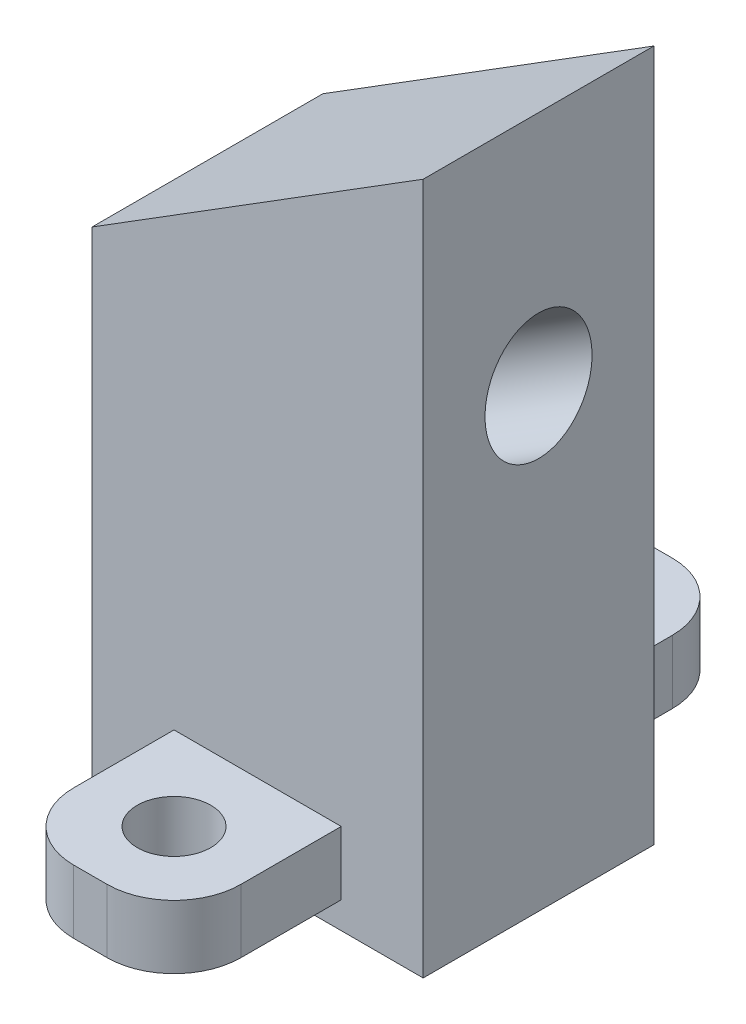
ISO-10303-21;
HEADER;
FILE_DESCRIPTION(('STEP AP214'),'2;1');
FILE_NAME('part.step','',(''),(''),'','','');
FILE_SCHEMA(('AUTOMOTIVE_DESIGN { 1 0 10303 214 1 1 1 1 }'));
ENDSEC;
DATA;
#1=APPLICATION_CONTEXT('core data for automotive mechanical design processes');
#2=APPLICATION_PROTOCOL_DEFINITION('international standard','automotive_design',2000,#1);
#3=PRODUCT_CONTEXT('',#1,'mechanical');
#4=PRODUCT('Part','Part','',(#3));
#5=PRODUCT_RELATED_PRODUCT_CATEGORY('part','',(#4));
#6=PRODUCT_DEFINITION_FORMATION('','',#4);
#7=PRODUCT_DEFINITION_CONTEXT('part definition',#1,'design');
#8=PRODUCT_DEFINITION('design','',#6,#7);
#9=PRODUCT_DEFINITION_SHAPE('','',#8);
#10=(LENGTH_UNIT() NAMED_UNIT(*) SI_UNIT(.MILLI.,.METRE.));
#11=(NAMED_UNIT(*) PLANE_ANGLE_UNIT() SI_UNIT($,.RADIAN.));
#12=(NAMED_UNIT(*) SI_UNIT($,.STERADIAN.) SOLID_ANGLE_UNIT());
#13=UNCERTAINTY_MEASURE_WITH_UNIT(LENGTH_MEASURE(1.E-05),#10,'distance_accuracy_value','');
#14=(GEOMETRIC_REPRESENTATION_CONTEXT(3) GLOBAL_UNCERTAINTY_ASSIGNED_CONTEXT((#13)) GLOBAL_UNIT_ASSIGNED_CONTEXT((#10,
#11,#12)) REPRESENTATION_CONTEXT('',''));
#15=CARTESIAN_POINT('',(0.,0.,0.));
#16=DIRECTION('',(0.,0.,1.));
#17=DIRECTION('',(1.,0.,0.));
#18=AXIS2_PLACEMENT_3D('',#15,#16,#17);
#19=CARTESIAN_POINT('',(-6.20378690597744,5.07930318868357,0.));
#20=DIRECTION('',(0.848048096156425,0.529919264233206,0.));
#21=DIRECTION('',(-0.529919264233206,0.848048096156425,0.));
#22=AXIS2_PLACEMENT_3D('',#19,#20,#21);
#23=CYLINDRICAL_SURFACE('',#22,1.6);
#24=CARTESIAN_POINT('',(7.45,13.6111361637298,0.));
#25=DIRECTION('',(-1.,0.,0.));
#26=DIRECTION('',(0.,1.,0.));
#27=AXIS2_PLACEMENT_3D('',#24,#25,#26);
#28=ELLIPSE('',#27,1.88668544537936,1.6);
#29=CARTESIAN_POINT('',(7.45,15.4978216091091,0.));
#30=VERTEX_POINT('',#29);
#31=EDGE_CURVE('E212',#30,#30,#28,.T.);
#32=ORIENTED_EDGE('',*,*,#31,.F.);
#33=EDGE_LOOP('',(#32));
#34=FACE_BOUND('',#33,.T.);
#35=CARTESIAN_POINT('',(-1.45,8.04979893173675,0.));
#36=DIRECTION('',(-1.,0.,0.));
#37=DIRECTION('',(0.,1.,0.));
#38=AXIS2_PLACEMENT_3D('',#35,#36,#37);
#39=ELLIPSE('',#38,1.88668544537936,1.6);
#40=CARTESIAN_POINT('',(-1.45,9.9364843771161,0.));
#41=VERTEX_POINT('',#40);
#42=EDGE_CURVE('E12',#41,#41,#39,.F.);
#43=ORIENTED_EDGE('',*,*,#42,.F.);
#44=EDGE_LOOP('',(#43));
#45=FACE_BOUND('',#44,.T.);
#46=ADVANCED_FACE('F43',(#34,#45),#23,.F.);
#47=CARTESIAN_POINT('',(-4.95,1.5,-3.45));
#48=DIRECTION('',(0.,0.,1.));
#49=DIRECTION('',(1.,0.,0.));
#50=AXIS2_PLACEMENT_3D('',#47,#48,#49);
#51=PLANE('',#50);
#52=DIRECTION('',(0.,1.,0.));
#53=VECTOR('',#52,1.);
#54=CARTESIAN_POINT('',(-2.45,1.5,-3.45));
#55=LINE('',#54,#53);
#56=CARTESIAN_POINT('',(-2.45,0.,-3.45));
#57=VERTEX_POINT('',#56);
#58=CARTESIAN_POINT('',(-2.45,14.5,-3.45));
#59=VERTEX_POINT('',#58);
#60=EDGE_CURVE('E217',#57,#59,#55,.T.);
#61=ORIENTED_EDGE('',*,*,#60,.T.);
#62=DIRECTION('',(0.848048096156425,0.529919264233206,0.));
#63=VECTOR('',#62,1.);
#64=CARTESIAN_POINT('',(-2.45,14.5,-3.45));
#65=LINE('',#64,#63);
#66=CARTESIAN_POINT('',(7.45,20.6862065839024,-3.45));
#67=VERTEX_POINT('',#66);
#68=EDGE_CURVE('E222',#59,#67,#65,.T.);
#69=ORIENTED_EDGE('',*,*,#68,.T.);
#70=DIRECTION('',(0.,-1.,0.));
#71=VECTOR('',#70,1.);
#72=CARTESIAN_POINT('',(7.45,1.5,-3.45));
#73=LINE('',#72,#71);
#74=CARTESIAN_POINT('',(7.45,0.,-3.45));
#75=VERTEX_POINT('',#74);
#76=EDGE_CURVE('E244',#67,#75,#73,.T.);
#77=ORIENTED_EDGE('',*,*,#76,.T.);
#78=DIRECTION('',(-1.,0.,0.));
#79=VECTOR('',#78,1.);
#80=CARTESIAN_POINT('',(-4.95,0.,-3.45));
#81=LINE('',#80,#79);
#82=EDGE_CURVE('E237',#75,#57,#81,.T.);
#83=ORIENTED_EDGE('',*,*,#82,.T.);
#84=EDGE_LOOP('',(#61,#69,#77,#83));
#85=FACE_BOUND('',#84,.T.);
#86=DIRECTION('',(-1.,0.,0.));
#87=VECTOR('',#86,1.);
#88=CARTESIAN_POINT('',(0.,2.7,-3.45));
#89=LINE('',#88,#87);
#90=CARTESIAN_POINT('',(5.,2.7,-3.45));
#91=VERTEX_POINT('',#90);
#92=CARTESIAN_POINT('',(0.,2.7,-3.45));
#93=VERTEX_POINT('',#92);
#94=EDGE_CURVE('E161',#91,#93,#89,.T.);
#95=ORIENTED_EDGE('',*,*,#94,.T.);
#96=DIRECTION('',(0.,-1.,0.));
#97=VECTOR('',#96,1.);
#98=CARTESIAN_POINT('',(0.,2.7,-3.45));
#99=LINE('',#98,#97);
#100=CARTESIAN_POINT('',(0.,0.8,-3.45));
#101=VERTEX_POINT('',#100);
#102=EDGE_CURVE('E175',#93,#101,#99,.T.);
#103=ORIENTED_EDGE('',*,*,#102,.T.);
#104=DIRECTION('',(-1.,0.,0.));
#105=VECTOR('',#104,1.);
#106=CARTESIAN_POINT('',(0.,0.8,-3.45));
#107=LINE('',#106,#105);
#108=CARTESIAN_POINT('',(5.,0.8,-3.45));
#109=VERTEX_POINT('',#108);
#110=EDGE_CURVE('E174',#109,#101,#107,.T.);
#111=ORIENTED_EDGE('',*,*,#110,.F.);
#112=DIRECTION('',(0.,-1.,0.));
#113=VECTOR('',#112,1.);
#114=CARTESIAN_POINT('',(5.,2.7,-3.45));
#115=LINE('',#114,#113);
#116=EDGE_CURVE('E159',#91,#109,#115,.T.);
#117=ORIENTED_EDGE('',*,*,#116,.F.);
#118=EDGE_LOOP('',(#95,#103,#111,#117));
#119=FACE_BOUND('',#118,.T.);
#120=ADVANCED_FACE('F172',(#85,#119),#51,.F.);
#121=CARTESIAN_POINT('',(-4.95,1.5,3.45));
#122=DIRECTION('',(0.,0.,-1.));
#123=DIRECTION('',(-1.,0.,0.));
#124=AXIS2_PLACEMENT_3D('',#121,#122,#123);
#125=PLANE('',#124);
#126=DIRECTION('',(0.848048096156425,0.529919264233206,0.));
#127=VECTOR('',#126,1.);
#128=CARTESIAN_POINT('',(-2.45,14.5,3.45));
#129=LINE('',#128,#127);
#130=CARTESIAN_POINT('',(-2.45,14.5,3.45));
#131=VERTEX_POINT('',#130);
#132=CARTESIAN_POINT('',(7.45,20.6862065839024,3.45));
#133=VERTEX_POINT('',#132);
#134=EDGE_CURVE('E221',#131,#133,#129,.T.);
#135=ORIENTED_EDGE('',*,*,#134,.F.);
#136=DIRECTION('',(0.,1.,0.));
#137=VECTOR('',#136,1.);
#138=CARTESIAN_POINT('',(-2.45,1.5,3.45));
#139=LINE('',#138,#137);
#140=CARTESIAN_POINT('',(-2.45,0.,3.45));
#141=VERTEX_POINT('',#140);
#142=EDGE_CURVE('E218',#141,#131,#139,.T.);
#143=ORIENTED_EDGE('',*,*,#142,.F.);
#144=DIRECTION('',(1.,0.,0.));
#145=VECTOR('',#144,1.);
#146=CARTESIAN_POINT('',(-4.95,0.,3.45));
#147=LINE('',#146,#145);
#148=CARTESIAN_POINT('',(7.45,0.,3.45));
#149=VERTEX_POINT('',#148);
#150=EDGE_CURVE('E239',#141,#149,#147,.T.);
#151=ORIENTED_EDGE('',*,*,#150,.T.);
#152=DIRECTION('',(0.,-1.,0.));
#153=VECTOR('',#152,1.);
#154=CARTESIAN_POINT('',(7.45,1.5,3.45));
#155=LINE('',#154,#153);
#156=EDGE_CURVE('E241',#133,#149,#155,.T.);
#157=ORIENTED_EDGE('',*,*,#156,.F.);
#158=EDGE_LOOP('',(#135,#143,#151,#157));
#159=FACE_BOUND('',#158,.T.);
#160=DIRECTION('',(-1.,0.,0.));
#161=VECTOR('',#160,1.);
#162=CARTESIAN_POINT('',(0.,2.7,3.45));
#163=LINE('',#162,#161);
#164=CARTESIAN_POINT('',(5.,2.7,3.45));
#165=VERTEX_POINT('',#164);
#166=CARTESIAN_POINT('',(0.,2.7,3.45));
#167=VERTEX_POINT('',#166);
#168=EDGE_CURVE('E194',#165,#167,#163,.T.);
#169=ORIENTED_EDGE('',*,*,#168,.F.);
#170=DIRECTION('',(0.,-1.,0.));
#171=VECTOR('',#170,1.);
#172=CARTESIAN_POINT('',(5.,2.7,3.45));
#173=LINE('',#172,#171);
#174=CARTESIAN_POINT('',(5.,0.8,3.45));
#175=VERTEX_POINT('',#174);
#176=EDGE_CURVE('E209',#165,#175,#173,.T.);
#177=ORIENTED_EDGE('',*,*,#176,.T.);
#178=DIRECTION('',(-1.,0.,0.));
#179=VECTOR('',#178,1.);
#180=CARTESIAN_POINT('',(0.,0.8,3.45));
#181=LINE('',#180,#179);
#182=CARTESIAN_POINT('',(0.,0.8,3.45));
#183=VERTEX_POINT('',#182);
#184=EDGE_CURVE('E187',#175,#183,#181,.T.);
#185=ORIENTED_EDGE('',*,*,#184,.T.);
#186=DIRECTION('',(0.,-1.,0.));
#187=VECTOR('',#186,1.);
#188=CARTESIAN_POINT('',(0.,2.7,3.45));
#189=LINE('',#188,#187);
#190=EDGE_CURVE('E197',#167,#183,#189,.T.);
#191=ORIENTED_EDGE('',*,*,#190,.F.);
#192=EDGE_LOOP('',(#169,#177,#185,#191));
#193=FACE_BOUND('',#192,.T.);
#194=ADVANCED_FACE('F331',(#159,#193),#125,.F.);
#195=CARTESIAN_POINT('',(7.45,1.5,-3.45));
#196=DIRECTION('',(-1.,0.,0.));
#197=DIRECTION('',(0.,0.,1.));
#198=AXIS2_PLACEMENT_3D('',#195,#196,#197);
#199=PLANE('',#198);
#200=ORIENTED_EDGE('',*,*,#31,.T.);
#201=EDGE_LOOP('',(#200));
#202=FACE_BOUND('',#201,.T.);
#203=DIRECTION('',(0.,0.,-1.));
#204=VECTOR('',#203,1.);
#205=CARTESIAN_POINT('',(7.45,0.,-3.45));
#206=LINE('',#205,#204);
#207=EDGE_CURVE('E233',#149,#75,#206,.T.);
#208=ORIENTED_EDGE('',*,*,#207,.T.);
#209=ORIENTED_EDGE('',*,*,#76,.F.);
#210=DIRECTION('',(0.,0.,-1.));
#211=VECTOR('',#210,1.);
#212=CARTESIAN_POINT('',(7.45,20.6862065839024,3.45));
#213=LINE('',#212,#211);
#214=EDGE_CURVE('E230',#133,#67,#213,.T.);
#215=ORIENTED_EDGE('',*,*,#214,.F.);
#216=ORIENTED_EDGE('',*,*,#156,.T.);
#217=EDGE_LOOP('',(#208,#209,#215,#216));
#218=FACE_BOUND('',#217,.T.);
#219=ADVANCED_FACE('F352',(#202,#218),#199,.F.);
#220=CARTESIAN_POINT('',(-4.95,0.,0.950000000000001));
#221=DIRECTION('',(0.,-1.,0.));
#222=DIRECTION('',(0.,0.,-1.));
#223=AXIS2_PLACEMENT_3D('',#220,#221,#222);
#224=PLANE('',#223);
#225=DIRECTION('',(0.,0.,1.));
#226=VECTOR('',#225,1.);
#227=CARTESIAN_POINT('',(-2.45,0.,0.95));
#228=LINE('',#227,#226);
#229=EDGE_CURVE('E247',#57,#141,#228,.T.);
#230=ORIENTED_EDGE('',*,*,#229,.F.);
#231=ORIENTED_EDGE('',*,*,#82,.F.);
#232=ORIENTED_EDGE('',*,*,#207,.F.);
#233=ORIENTED_EDGE('',*,*,#150,.F.);
#234=EDGE_LOOP('',(#230,#231,#232,#233));
#235=FACE_BOUND('',#234,.T.);
#236=ADVANCED_FACE('F344',(#235),#224,.T.);
#237=CARTESIAN_POINT('',(-2.45,14.5,3.45));
#238=DIRECTION('',(-0.529919264233206,0.848048096156425,0.));
#239=DIRECTION('',(-0.848048096156425,-0.529919264233206,0.));
#240=AXIS2_PLACEMENT_3D('',#237,#238,#239);
#241=PLANE('',#240);
#242=ORIENTED_EDGE('',*,*,#68,.F.);
#243=DIRECTION('',(0.,0.,-1.));
#244=VECTOR('',#243,1.);
#245=CARTESIAN_POINT('',(-2.45,14.5,3.45));
#246=LINE('',#245,#244);
#247=EDGE_CURVE('E225',#131,#59,#246,.T.);
#248=ORIENTED_EDGE('',*,*,#247,.F.);
#249=ORIENTED_EDGE('',*,*,#134,.T.);
#250=ORIENTED_EDGE('',*,*,#214,.T.);
#251=EDGE_LOOP('',(#242,#248,#249,#250));
#252=FACE_BOUND('',#251,.T.);
#253=ADVANCED_FACE('F340',(#252),#241,.T.);
#254=CARTESIAN_POINT('',(-2.45,1.5,3.45));
#255=DIRECTION('',(-1.,0.,0.));
#256=DIRECTION('',(0.,-1.,0.));
#257=AXIS2_PLACEMENT_3D('',#254,#255,#256);
#258=PLANE('',#257);
#259=ORIENTED_EDGE('',*,*,#60,.F.);
#260=ORIENTED_EDGE('',*,*,#229,.T.);
#261=ORIENTED_EDGE('',*,*,#142,.T.);
#262=ORIENTED_EDGE('',*,*,#247,.T.);
#263=EDGE_LOOP('',(#259,#260,#261,#262));
#264=FACE_BOUND('',#263,.T.);
#265=ADVANCED_FACE('F343',(#264),#258,.T.);
#266=CARTESIAN_POINT('',(5.,2.7,0.));
#267=DIRECTION('',(-1.,0.,0.));
#268=DIRECTION('',(0.,0.,1.));
#269=AXIS2_PLACEMENT_3D('',#266,#267,#268);
#270=PLANE('',#269);
#271=DIRECTION('',(0.,0.,-1.));
#272=VECTOR('',#271,1.);
#273=CARTESIAN_POINT('',(5.,2.7,0.));
#274=LINE('',#273,#272);
#275=CARTESIAN_POINT('',(5.,2.7,6.45));
#276=VERTEX_POINT('',#275);
#277=EDGE_CURVE('E186',#276,#165,#274,.T.);
#278=ORIENTED_EDGE('',*,*,#277,.F.);
#279=DIRECTION('',(0.,-1.,0.));
#280=VECTOR('',#279,1.);
#281=CARTESIAN_POINT('',(5.,2.7,6.45));
#282=LINE('',#281,#280);
#283=CARTESIAN_POINT('',(5.,0.8,6.45));
#284=VERTEX_POINT('',#283);
#285=EDGE_CURVE('E265',#276,#284,#282,.T.);
#286=ORIENTED_EDGE('',*,*,#285,.T.);
#287=DIRECTION('',(0.,0.,-1.));
#288=VECTOR('',#287,1.);
#289=CARTESIAN_POINT('',(5.,0.8,0.));
#290=LINE('',#289,#288);
#291=EDGE_CURVE('E200',#284,#175,#290,.T.);
#292=ORIENTED_EDGE('',*,*,#291,.T.);
#293=ORIENTED_EDGE('',*,*,#176,.F.);
#294=EDGE_LOOP('',(#278,#286,#292,#293));
#295=FACE_BOUND('',#294,.T.);
#296=ADVANCED_FACE('F348',(#295),#270,.F.);
#297=CARTESIAN_POINT('',(0.,2.7,0.));
#298=DIRECTION('',(-1.,0.,0.));
#299=DIRECTION('',(0.,0.,1.));
#300=AXIS2_PLACEMENT_3D('',#297,#298,#299);
#301=PLANE('',#300);
#302=DIRECTION('',(0.,0.,-1.));
#303=VECTOR('',#302,1.);
#304=CARTESIAN_POINT('',(0.,0.8,0.));
#305=LINE('',#304,#303);
#306=CARTESIAN_POINT('',(0.,0.8,6.45));
#307=VERTEX_POINT('',#306);
#308=EDGE_CURVE('E205',#307,#183,#305,.T.);
#309=ORIENTED_EDGE('',*,*,#308,.F.);
#310=DIRECTION('',(0.,-1.,0.));
#311=VECTOR('',#310,1.);
#312=CARTESIAN_POINT('',(0.,2.7,6.45));
#313=LINE('',#312,#311);
#314=CARTESIAN_POINT('',(0.,2.7,6.45));
#315=VERTEX_POINT('',#314);
#316=EDGE_CURVE('E259',#307,#315,#313,.F.);
#317=ORIENTED_EDGE('',*,*,#316,.T.);
#318=DIRECTION('',(0.,0.,-1.));
#319=VECTOR('',#318,1.);
#320=CARTESIAN_POINT('',(0.,2.7,0.));
#321=LINE('',#320,#319);
#322=EDGE_CURVE('E192',#315,#167,#321,.T.);
#323=ORIENTED_EDGE('',*,*,#322,.T.);
#324=ORIENTED_EDGE('',*,*,#190,.T.);
#325=EDGE_LOOP('',(#309,#317,#323,#324));
#326=FACE_BOUND('',#325,.T.);
#327=ADVANCED_FACE('F471',(#326),#301,.T.);
#328=CARTESIAN_POINT('',(2.5,2.7,5.95));
#329=DIRECTION('',(0.,-1.,0.));
#330=DIRECTION('',(0.,0.,-1.));
#331=AXIS2_PLACEMENT_3D('',#328,#329,#330);
#332=CYLINDRICAL_SURFACE('',#331,1.1);
#333=CARTESIAN_POINT('',(2.5,2.7,5.95));
#334=DIRECTION('',(0.,-1.,0.));
#335=DIRECTION('',(0.,0.,-1.));
#336=AXIS2_PLACEMENT_3D('',#333,#334,#335);
#337=CIRCLE('',#336,1.1);
#338=CARTESIAN_POINT('',(2.5,2.7,4.85));
#339=VERTEX_POINT('',#338);
#340=EDGE_CURVE('E183',#339,#339,#337,.T.);
#341=CARTESIAN_POINT('',(2.5,0.8,5.95));
#342=DIRECTION('',(0.,-1.,0.));
#343=DIRECTION('',(0.,0.,-1.));
#344=AXIS2_PLACEMENT_3D('',#341,#342,#343);
#345=CIRCLE('',#344,1.1);
#346=CARTESIAN_POINT('',(2.5,0.8,4.85));
#347=VERTEX_POINT('',#346);
#348=EDGE_CURVE('E178',#347,#347,#345,.T.);
#349=CARTESIAN_POINT('',(2.5,2.7,4.85));
#350=CARTESIAN_POINT('',(2.5,2.68020833333333,4.85));
#351=CARTESIAN_POINT('',(2.5,2.66041666666667,4.85));
#352=CARTESIAN_POINT('',(2.5,2.62083333333333,4.85));
#353=CARTESIAN_POINT('',(2.5,2.60104166666667,4.85));
#354=CARTESIAN_POINT('',(2.5,2.56145833333333,4.85));
#355=CARTESIAN_POINT('',(2.5,2.54166666666667,4.85));
#356=CARTESIAN_POINT('',(2.5,2.50208333333333,4.85));
#357=CARTESIAN_POINT('',(2.5,2.48229166666667,4.85));
#358=CARTESIAN_POINT('',(2.5,2.44270833333333,4.85));
#359=CARTESIAN_POINT('',(2.5,2.42291666666667,4.85));
#360=CARTESIAN_POINT('',(2.5,2.38333333333333,4.85));
#361=CARTESIAN_POINT('',(2.5,2.36354166666667,4.85));
#362=CARTESIAN_POINT('',(2.5,2.32395833333333,4.85));
#363=CARTESIAN_POINT('',(2.5,2.30416666666667,4.85));
#364=CARTESIAN_POINT('',(2.5,2.26458333333333,4.85));
#365=CARTESIAN_POINT('',(2.5,2.24479166666667,4.85));
#366=CARTESIAN_POINT('',(2.5,2.20520833333333,4.85));
#367=CARTESIAN_POINT('',(2.5,2.18541666666667,4.85));
#368=CARTESIAN_POINT('',(2.5,2.14583333333333,4.85));
#369=CARTESIAN_POINT('',(2.5,2.12604166666667,4.85));
#370=CARTESIAN_POINT('',(2.5,2.08645833333333,4.85));
#371=CARTESIAN_POINT('',(2.5,2.06666666666667,4.85));
#372=CARTESIAN_POINT('',(2.5,2.02708333333333,4.85));
#373=CARTESIAN_POINT('',(2.5,2.00729166666667,4.85));
#374=CARTESIAN_POINT('',(2.5,1.96770833333333,4.85));
#375=CARTESIAN_POINT('',(2.5,1.94791666666667,4.85));
#376=CARTESIAN_POINT('',(2.5,1.90833333333333,4.85));
#377=CARTESIAN_POINT('',(2.5,1.88854166666667,4.85));
#378=CARTESIAN_POINT('',(2.5,1.84895833333333,4.85));
#379=CARTESIAN_POINT('',(2.5,1.82916666666667,4.85));
#380=CARTESIAN_POINT('',(2.5,1.78958333333333,4.85));
#381=CARTESIAN_POINT('',(2.5,1.76979166666667,4.85));
#382=CARTESIAN_POINT('',(2.5,1.73020833333333,4.85));
#383=CARTESIAN_POINT('',(2.5,1.71041666666667,4.85));
#384=CARTESIAN_POINT('',(2.5,1.67083333333333,4.85));
#385=CARTESIAN_POINT('',(2.5,1.65104166666667,4.85));
#386=CARTESIAN_POINT('',(2.5,1.61145833333333,4.85));
#387=CARTESIAN_POINT('',(2.5,1.59166666666667,4.85));
#388=CARTESIAN_POINT('',(2.5,1.55208333333333,4.85));
#389=CARTESIAN_POINT('',(2.5,1.53229166666667,4.85));
#390=CARTESIAN_POINT('',(2.5,1.49270833333333,4.85));
#391=CARTESIAN_POINT('',(2.5,1.47291666666667,4.85));
#392=CARTESIAN_POINT('',(2.5,1.43333333333333,4.85));
#393=CARTESIAN_POINT('',(2.5,1.41354166666667,4.85));
#394=CARTESIAN_POINT('',(2.5,1.37395833333333,4.85));
#395=CARTESIAN_POINT('',(2.5,1.35416666666667,4.85));
#396=CARTESIAN_POINT('',(2.5,1.31458333333333,4.85));
#397=CARTESIAN_POINT('',(2.5,1.29479166666667,4.85));
#398=CARTESIAN_POINT('',(2.5,1.25520833333333,4.85));
#399=CARTESIAN_POINT('',(2.5,1.23541666666667,4.85));
#400=CARTESIAN_POINT('',(2.5,1.19583333333333,4.85));
#401=CARTESIAN_POINT('',(2.5,1.17604166666667,4.85));
#402=CARTESIAN_POINT('',(2.5,1.13645833333333,4.85));
#403=CARTESIAN_POINT('',(2.5,1.11666666666667,4.85));
#404=CARTESIAN_POINT('',(2.5,1.07708333333333,4.85));
#405=CARTESIAN_POINT('',(2.5,1.05729166666667,4.85));
#406=CARTESIAN_POINT('',(2.5,1.01770833333333,4.85));
#407=CARTESIAN_POINT('',(2.5,0.997916666666667,4.85));
#408=CARTESIAN_POINT('',(2.5,0.958333333333333,4.85));
#409=CARTESIAN_POINT('',(2.5,0.938541666666667,4.85));
#410=CARTESIAN_POINT('',(2.5,0.898958333333333,4.85));
#411=CARTESIAN_POINT('',(2.5,0.879166666666667,4.85));
#412=CARTESIAN_POINT('',(2.5,0.839583333333333,4.85));
#413=CARTESIAN_POINT('',(2.5,0.819791666666667,4.85));
#414=CARTESIAN_POINT('',(2.5,0.8,4.85));
#415=B_SPLINE_CURVE_WITH_KNOTS('',3,(#349,#350,#351,#352,#353,#354,#355,#356,#357,#358,#359,
#360,#361,#362,#363,#364,#365,#366,#367,#368,#369,#370,#371,#372,#373,#374,#375,#376,#377,#378,
#379,#380,#381,#382,#383,#384,#385,#386,#387,#388,#389,#390,#391,#392,#393,#394,#395,#396,#397,
#398,#399,#400,#401,#402,#403,#404,#405,#406,#407,#408,#409,#410,#411,#412,#413,#414),
.UNSPECIFIED.,.F.,.F.,(4,2,2,2,2,2,2,2,2,2,2,2,2,2,2,2,2,2,2,2,2,2,2,2,2,2,2,2,2,2,2,2,4),(0.,
0.059375,0.11875,0.178125,0.2375,0.296875,0.35625,0.415625,0.475,0.534375,0.59375,0.653125,
0.7125,0.771875,0.83125,0.890625,0.95,1.009375,1.06875,1.128125,1.1875,1.246875,1.30625,
1.365625,1.425,1.484375,1.54375,1.603125,1.6625,1.721875,1.78125,1.840625,1.9),.UNSPECIFIED.);
#416=EDGE_CURVE('BSEAM338',#339,#347,#415,.T.);
#417=ORIENTED_EDGE('',*,*,#340,.F.);
#418=ORIENTED_EDGE('',*,*,#348,.T.);
#419=ORIENTED_EDGE('',*,*,#416,.T.);
#420=ORIENTED_EDGE('',*,*,#416,.F.);
#421=EDGE_LOOP('',(#417,#419,#418,#420));
#422=FACE_BOUND('',#421,.T.);
#423=ADVANCED_FACE('F338',(#422),#332,.F.);
#424=CARTESIAN_POINT('',(0.,2.7,8.45));
#425=DIRECTION('',(0.,0.,-1.));
#426=DIRECTION('',(-1.,0.,0.));
#427=AXIS2_PLACEMENT_3D('',#424,#425,#426);
#428=PLANE('',#427);
#429=DIRECTION('',(1.,0.,0.));
#430=VECTOR('',#429,1.);
#431=CARTESIAN_POINT('',(0.,2.7,8.45));
#432=LINE('',#431,#430);
#433=CARTESIAN_POINT('',(2.,2.7,8.45));
#434=VERTEX_POINT('',#433);
#435=CARTESIAN_POINT('',(3.,2.7,8.45));
#436=VERTEX_POINT('',#435);
#437=EDGE_CURVE('E189',#434,#436,#432,.T.);
#438=ORIENTED_EDGE('',*,*,#437,.F.);
#439=DIRECTION('',(0.,-1.,0.));
#440=VECTOR('',#439,1.);
#441=CARTESIAN_POINT('',(2.,0.8,8.45));
#442=LINE('',#441,#440);
#443=CARTESIAN_POINT('',(2.,0.8,8.45));
#444=VERTEX_POINT('',#443);
#445=EDGE_CURVE('E252',#434,#444,#442,.T.);
#446=ORIENTED_EDGE('',*,*,#445,.T.);
#447=DIRECTION('',(1.,0.,0.));
#448=VECTOR('',#447,1.);
#449=CARTESIAN_POINT('',(0.,0.8,8.45));
#450=LINE('',#449,#448);
#451=CARTESIAN_POINT('',(3.,0.8,8.45));
#452=VERTEX_POINT('',#451);
#453=EDGE_CURVE('E202',#444,#452,#450,.T.);
#454=ORIENTED_EDGE('',*,*,#453,.T.);
#455=DIRECTION('',(0.,-1.,0.));
#456=VECTOR('',#455,1.);
#457=CARTESIAN_POINT('',(3.,2.7,8.45));
#458=LINE('',#457,#456);
#459=EDGE_CURVE('E250',#452,#436,#458,.F.);
#460=ORIENTED_EDGE('',*,*,#459,.T.);
#461=EDGE_LOOP('',(#438,#446,#454,#460));
#462=FACE_BOUND('',#461,.T.);
#463=ADVANCED_FACE('F485',(#462),#428,.F.);
#464=CARTESIAN_POINT('',(0.,2.7,0.));
#465=DIRECTION('',(0.,-1.,0.));
#466=DIRECTION('',(0.,0.,-1.));
#467=AXIS2_PLACEMENT_3D('',#464,#465,#466);
#468=PLANE('',#467);
#469=ORIENTED_EDGE('',*,*,#340,.T.);
#470=EDGE_LOOP('',(#469));
#471=FACE_BOUND('',#470,.T.);
#472=ORIENTED_EDGE('',*,*,#322,.F.);
#473=CARTESIAN_POINT('',(2.,2.7,6.45));
#474=DIRECTION('',(0.,-1.,0.));
#475=DIRECTION('',(0.,0.,-1.));
#476=AXIS2_PLACEMENT_3D('',#473,#474,#475);
#477=CIRCLE('',#476,2.);
#478=EDGE_CURVE('E263',#315,#434,#477,.F.);
#479=ORIENTED_EDGE('',*,*,#478,.T.);
#480=ORIENTED_EDGE('',*,*,#437,.T.);
#481=CARTESIAN_POINT('',(3.,2.7,6.45));
#482=DIRECTION('',(0.,-1.,0.));
#483=DIRECTION('',(0.,0.,-1.));
#484=AXIS2_PLACEMENT_3D('',#481,#482,#483);
#485=CIRCLE('',#484,2.);
#486=EDGE_CURVE('E261',#436,#276,#485,.F.);
#487=ORIENTED_EDGE('',*,*,#486,.T.);
#488=ORIENTED_EDGE('',*,*,#277,.T.);
#489=ORIENTED_EDGE('',*,*,#168,.T.);
#490=EDGE_LOOP('',(#472,#479,#480,#487,#488,#489));
#491=FACE_BOUND('',#490,.T.);
#492=ADVANCED_FACE('F492',(#471,#491),#468,.F.);
#493=CARTESIAN_POINT('',(0.,0.8,0.));
#494=DIRECTION('',(0.,-1.,0.));
#495=DIRECTION('',(0.,0.,-1.));
#496=AXIS2_PLACEMENT_3D('',#493,#494,#495);
#497=PLANE('',#496);
#498=ORIENTED_EDGE('',*,*,#348,.F.);
#499=EDGE_LOOP('',(#498));
#500=FACE_BOUND('',#499,.T.);
#501=ORIENTED_EDGE('',*,*,#453,.F.);
#502=CARTESIAN_POINT('',(2.,0.8,6.45));
#503=DIRECTION('',(0.,-1.,0.));
#504=DIRECTION('',(0.,0.,-1.));
#505=AXIS2_PLACEMENT_3D('',#502,#503,#504);
#506=CIRCLE('',#505,2.);
#507=EDGE_CURVE('E257',#444,#307,#506,.T.);
#508=ORIENTED_EDGE('',*,*,#507,.T.);
#509=ORIENTED_EDGE('',*,*,#308,.T.);
#510=ORIENTED_EDGE('',*,*,#184,.F.);
#511=ORIENTED_EDGE('',*,*,#291,.F.);
#512=CARTESIAN_POINT('',(3.,0.8,6.45));
#513=DIRECTION('',(0.,-1.,0.));
#514=DIRECTION('',(0.,0.,-1.));
#515=AXIS2_PLACEMENT_3D('',#512,#513,#514);
#516=CIRCLE('',#515,2.);
#517=EDGE_CURVE('E255',#284,#452,#516,.T.);
#518=ORIENTED_EDGE('',*,*,#517,.T.);
#519=EDGE_LOOP('',(#501,#508,#509,#510,#511,#518));
#520=FACE_BOUND('',#519,.T.);
#521=ADVANCED_FACE('F364',(#500,#520),#497,.T.);
#522=CARTESIAN_POINT('',(2.,2.7,6.45));
#523=DIRECTION('',(0.,1.,0.));
#524=DIRECTION('',(0.,0.,1.));
#525=AXIS2_PLACEMENT_3D('',#522,#523,#524);
#526=CYLINDRICAL_SURFACE('',#525,2.);
#527=ORIENTED_EDGE('',*,*,#478,.F.);
#528=ORIENTED_EDGE('',*,*,#316,.F.);
#529=ORIENTED_EDGE('',*,*,#507,.F.);
#530=ORIENTED_EDGE('',*,*,#445,.F.);
#531=EDGE_LOOP('',(#527,#528,#529,#530));
#532=FACE_BOUND('',#531,.T.);
#533=ADVANCED_FACE('F360',(#532),#526,.T.);
#534=CARTESIAN_POINT('',(3.,2.7,6.45));
#535=DIRECTION('',(0.,-1.,0.));
#536=DIRECTION('',(0.,0.,-1.));
#537=AXIS2_PLACEMENT_3D('',#534,#535,#536);
#538=CYLINDRICAL_SURFACE('',#537,2.);
#539=ORIENTED_EDGE('',*,*,#486,.F.);
#540=ORIENTED_EDGE('',*,*,#459,.F.);
#541=ORIENTED_EDGE('',*,*,#517,.F.);
#542=ORIENTED_EDGE('',*,*,#285,.F.);
#543=EDGE_LOOP('',(#539,#540,#541,#542));
#544=FACE_BOUND('',#543,.T.);
#545=ADVANCED_FACE('F363',(#544),#538,.T.);
#546=CARTESIAN_POINT('',(5.,2.7,0.));
#547=DIRECTION('',(1.,0.,0.));
#548=DIRECTION('',(0.,0.,-1.));
#549=AXIS2_PLACEMENT_3D('',#546,#547,#548);
#550=PLANE('',#549);
#551=DIRECTION('',(0.,0.,1.));
#552=VECTOR('',#551,1.);
#553=CARTESIAN_POINT('',(5.,0.8,0.));
#554=LINE('',#553,#552);
#555=CARTESIAN_POINT('',(5.,0.8,-6.45));
#556=VERTEX_POINT('',#555);
#557=EDGE_CURVE('E305',#556,#109,#554,.T.);
#558=ORIENTED_EDGE('',*,*,#557,.F.);
#559=DIRECTION('',(0.,-1.,0.));
#560=VECTOR('',#559,1.);
#561=CARTESIAN_POINT('',(5.,2.7,-6.45));
#562=LINE('',#561,#560);
#563=CARTESIAN_POINT('',(5.,2.7,-6.45));
#564=VERTEX_POINT('',#563);
#565=EDGE_CURVE('E51',#556,#564,#562,.F.);
#566=ORIENTED_EDGE('',*,*,#565,.T.);
#567=DIRECTION('',(0.,0.,1.));
#568=VECTOR('',#567,1.);
#569=CARTESIAN_POINT('',(5.,2.7,0.));
#570=LINE('',#569,#568);
#571=EDGE_CURVE('E155',#564,#91,#570,.T.);
#572=ORIENTED_EDGE('',*,*,#571,.T.);
#573=ORIENTED_EDGE('',*,*,#116,.T.);
#574=EDGE_LOOP('',(#558,#566,#572,#573));
#575=FACE_BOUND('',#574,.T.);
#576=ADVANCED_FACE('F157',(#575),#550,.T.);
#577=CARTESIAN_POINT('',(0.,2.7,-8.45));
#578=DIRECTION('',(0.,0.,-1.));
#579=DIRECTION('',(-1.,0.,0.));
#580=AXIS2_PLACEMENT_3D('',#577,#578,#579);
#581=PLANE('',#580);
#582=DIRECTION('',(1.,0.,0.));
#583=VECTOR('',#582,1.);
#584=CARTESIAN_POINT('',(0.,0.8,-8.45));
#585=LINE('',#584,#583);
#586=CARTESIAN_POINT('',(2.,0.8,-8.45));
#587=VERTEX_POINT('',#586);
#588=CARTESIAN_POINT('',(3.,0.8,-8.45));
#589=VERTEX_POINT('',#588);
#590=EDGE_CURVE('E295',#587,#589,#585,.T.);
#591=ORIENTED_EDGE('',*,*,#590,.F.);
#592=DIRECTION('',(0.,-1.,0.));
#593=VECTOR('',#592,1.);
#594=CARTESIAN_POINT('',(2.,2.7,-8.45));
#595=LINE('',#594,#593);
#596=CARTESIAN_POINT('',(2.,2.7,-8.45));
#597=VERTEX_POINT('',#596);
#598=EDGE_CURVE('E278',#587,#597,#595,.F.);
#599=ORIENTED_EDGE('',*,*,#598,.T.);
#600=DIRECTION('',(1.,0.,0.));
#601=VECTOR('',#600,1.);
#602=CARTESIAN_POINT('',(0.,2.7,-8.45));
#603=LINE('',#602,#601);
#604=CARTESIAN_POINT('',(3.,2.7,-8.45));
#605=VERTEX_POINT('',#604);
#606=EDGE_CURVE('E176',#597,#605,#603,.T.);
#607=ORIENTED_EDGE('',*,*,#606,.T.);
#608=DIRECTION('',(0.,-1.,0.));
#609=VECTOR('',#608,1.);
#610=CARTESIAN_POINT('',(3.,2.7,-8.45));
#611=LINE('',#610,#609);
#612=EDGE_CURVE('E275',#605,#589,#611,.T.);
#613=ORIENTED_EDGE('',*,*,#612,.T.);
#614=EDGE_LOOP('',(#591,#599,#607,#613));
#615=FACE_BOUND('',#614,.T.);
#616=ADVANCED_FACE('F298',(#615),#581,.T.);
#617=CARTESIAN_POINT('',(0.,2.7,0.));
#618=DIRECTION('',(1.,0.,0.));
#619=DIRECTION('',(0.,0.,-1.));
#620=AXIS2_PLACEMENT_3D('',#617,#618,#619);
#621=PLANE('',#620);
#622=DIRECTION('',(0.,0.,1.));
#623=VECTOR('',#622,1.);
#624=CARTESIAN_POINT('',(0.,2.7,0.));
#625=LINE('',#624,#623);
#626=CARTESIAN_POINT('',(0.,2.7,-6.45));
#627=VERTEX_POINT('',#626);
#628=EDGE_CURVE('E167',#627,#93,#625,.T.);
#629=ORIENTED_EDGE('',*,*,#628,.F.);
#630=DIRECTION('',(0.,-1.,0.));
#631=VECTOR('',#630,1.);
#632=CARTESIAN_POINT('',(0.,0.8,-6.45));
#633=LINE('',#632,#631);
#634=CARTESIAN_POINT('',(0.,0.8,-6.45));
#635=VERTEX_POINT('',#634);
#636=EDGE_CURVE('E268',#627,#635,#633,.T.);
#637=ORIENTED_EDGE('',*,*,#636,.T.);
#638=DIRECTION('',(0.,0.,1.));
#639=VECTOR('',#638,1.);
#640=CARTESIAN_POINT('',(0.,0.8,0.));
#641=LINE('',#640,#639);
#642=EDGE_CURVE('E296',#635,#101,#641,.T.);
#643=ORIENTED_EDGE('',*,*,#642,.T.);
#644=ORIENTED_EDGE('',*,*,#102,.F.);
#645=EDGE_LOOP('',(#629,#637,#643,#644));
#646=FACE_BOUND('',#645,.T.);
#647=ADVANCED_FACE('F287',(#646),#621,.F.);
#648=CARTESIAN_POINT('',(2.5,2.7,-5.95));
#649=DIRECTION('',(0.,-1.,0.));
#650=DIRECTION('',(0.,0.,-1.));
#651=AXIS2_PLACEMENT_3D('',#648,#649,#650);
#652=CYLINDRICAL_SURFACE('',#651,1.1);
#653=CARTESIAN_POINT('',(2.5,2.7,-5.95));
#654=DIRECTION('',(0.,1.,0.));
#655=DIRECTION('',(0.,0.,1.));
#656=AXIS2_PLACEMENT_3D('',#653,#654,#655);
#657=CIRCLE('',#656,1.1);
#658=CARTESIAN_POINT('',(2.5,2.7,-7.05));
#659=VERTEX_POINT('',#658);
#660=EDGE_CURVE('E162',#659,#659,#657,.T.);
#661=CARTESIAN_POINT('',(2.5,0.8,-5.95));
#662=DIRECTION('',(0.,1.,0.));
#663=DIRECTION('',(0.,0.,1.));
#664=AXIS2_PLACEMENT_3D('',#661,#662,#663);
#665=CIRCLE('',#664,1.1);
#666=CARTESIAN_POINT('',(2.5,0.8,-7.05));
#667=VERTEX_POINT('',#666);
#668=EDGE_CURVE('E307',#667,#667,#665,.T.);
#669=CARTESIAN_POINT('',(2.5,2.7,-7.05));
#670=CARTESIAN_POINT('',(2.5,2.68020833333333,-7.05));
#671=CARTESIAN_POINT('',(2.5,2.66041666666667,-7.05));
#672=CARTESIAN_POINT('',(2.5,2.62083333333333,-7.05));
#673=CARTESIAN_POINT('',(2.5,2.60104166666667,-7.05));
#674=CARTESIAN_POINT('',(2.5,2.56145833333333,-7.05));
#675=CARTESIAN_POINT('',(2.5,2.54166666666667,-7.05));
#676=CARTESIAN_POINT('',(2.5,2.50208333333333,-7.05));
#677=CARTESIAN_POINT('',(2.5,2.48229166666667,-7.05));
#678=CARTESIAN_POINT('',(2.5,2.44270833333333,-7.05));
#679=CARTESIAN_POINT('',(2.5,2.42291666666667,-7.05));
#680=CARTESIAN_POINT('',(2.5,2.38333333333333,-7.05));
#681=CARTESIAN_POINT('',(2.5,2.36354166666667,-7.05));
#682=CARTESIAN_POINT('',(2.5,2.32395833333333,-7.05));
#683=CARTESIAN_POINT('',(2.5,2.30416666666667,-7.05));
#684=CARTESIAN_POINT('',(2.5,2.26458333333333,-7.05));
#685=CARTESIAN_POINT('',(2.5,2.24479166666667,-7.05));
#686=CARTESIAN_POINT('',(2.5,2.20520833333333,-7.05));
#687=CARTESIAN_POINT('',(2.5,2.18541666666667,-7.05));
#688=CARTESIAN_POINT('',(2.5,2.14583333333333,-7.05));
#689=CARTESIAN_POINT('',(2.5,2.12604166666667,-7.05));
#690=CARTESIAN_POINT('',(2.5,2.08645833333333,-7.05));
#691=CARTESIAN_POINT('',(2.5,2.06666666666667,-7.05));
#692=CARTESIAN_POINT('',(2.5,2.02708333333333,-7.05));
#693=CARTESIAN_POINT('',(2.5,2.00729166666667,-7.05));
#694=CARTESIAN_POINT('',(2.5,1.96770833333333,-7.05));
#695=CARTESIAN_POINT('',(2.5,1.94791666666667,-7.05));
#696=CARTESIAN_POINT('',(2.5,1.90833333333333,-7.05));
#697=CARTESIAN_POINT('',(2.5,1.88854166666667,-7.05));
#698=CARTESIAN_POINT('',(2.5,1.84895833333333,-7.05));
#699=CARTESIAN_POINT('',(2.5,1.82916666666667,-7.05));
#700=CARTESIAN_POINT('',(2.5,1.78958333333333,-7.05));
#701=CARTESIAN_POINT('',(2.5,1.76979166666667,-7.05));
#702=CARTESIAN_POINT('',(2.5,1.73020833333333,-7.05));
#703=CARTESIAN_POINT('',(2.5,1.71041666666667,-7.05));
#704=CARTESIAN_POINT('',(2.5,1.67083333333333,-7.05));
#705=CARTESIAN_POINT('',(2.5,1.65104166666667,-7.05));
#706=CARTESIAN_POINT('',(2.5,1.61145833333333,-7.05));
#707=CARTESIAN_POINT('',(2.5,1.59166666666667,-7.05));
#708=CARTESIAN_POINT('',(2.5,1.55208333333333,-7.05));
#709=CARTESIAN_POINT('',(2.5,1.53229166666667,-7.05));
#710=CARTESIAN_POINT('',(2.5,1.49270833333333,-7.05));
#711=CARTESIAN_POINT('',(2.5,1.47291666666667,-7.05));
#712=CARTESIAN_POINT('',(2.5,1.43333333333333,-7.05));
#713=CARTESIAN_POINT('',(2.5,1.41354166666667,-7.05));
#714=CARTESIAN_POINT('',(2.5,1.37395833333333,-7.05));
#715=CARTESIAN_POINT('',(2.5,1.35416666666667,-7.05));
#716=CARTESIAN_POINT('',(2.5,1.31458333333333,-7.05));
#717=CARTESIAN_POINT('',(2.5,1.29479166666667,-7.05));
#718=CARTESIAN_POINT('',(2.5,1.25520833333333,-7.05));
#719=CARTESIAN_POINT('',(2.5,1.23541666666667,-7.05));
#720=CARTESIAN_POINT('',(2.5,1.19583333333333,-7.05));
#721=CARTESIAN_POINT('',(2.5,1.17604166666667,-7.05));
#722=CARTESIAN_POINT('',(2.5,1.13645833333333,-7.05));
#723=CARTESIAN_POINT('',(2.5,1.11666666666667,-7.05));
#724=CARTESIAN_POINT('',(2.5,1.07708333333333,-7.05));
#725=CARTESIAN_POINT('',(2.5,1.05729166666667,-7.05));
#726=CARTESIAN_POINT('',(2.5,1.01770833333333,-7.05));
#727=CARTESIAN_POINT('',(2.5,0.997916666666667,-7.05));
#728=CARTESIAN_POINT('',(2.5,0.958333333333333,-7.05));
#729=CARTESIAN_POINT('',(2.5,0.938541666666667,-7.05));
#730=CARTESIAN_POINT('',(2.5,0.898958333333333,-7.05));
#731=CARTESIAN_POINT('',(2.5,0.879166666666667,-7.05));
#732=CARTESIAN_POINT('',(2.5,0.839583333333333,-7.05));
#733=CARTESIAN_POINT('',(2.5,0.819791666666667,-7.05));
#734=CARTESIAN_POINT('',(2.5,0.8,-7.05));
#735=B_SPLINE_CURVE_WITH_KNOTS('',3,(#669,#670,#671,#672,#673,#674,#675,#676,#677,#678,#679,
#680,#681,#682,#683,#684,#685,#686,#687,#688,#689,#690,#691,#692,#693,#694,#695,#696,#697,#698,
#699,#700,#701,#702,#703,#704,#705,#706,#707,#708,#709,#710,#711,#712,#713,#714,#715,#716,#717,
#718,#719,#720,#721,#722,#723,#724,#725,#726,#727,#728,#729,#730,#731,#732,#733,#734),
.UNSPECIFIED.,.F.,.F.,(4,2,2,2,2,2,2,2,2,2,2,2,2,2,2,2,2,2,2,2,2,2,2,2,2,2,2,2,2,2,2,2,4),(0.,
0.059375,0.11875,0.178125,0.2375,0.296875,0.35625,0.415625,0.475,0.534375,0.59375,0.653125,
0.7125,0.771875,0.831249999999999,0.890625,0.95,1.009375,1.06875,1.128125,1.1875,1.246875,
1.30625,1.365625,1.425,1.484375,1.54375,1.603125,1.6625,1.721875,1.78125,1.840625,1.9),.UNSPECIFIED.);
#736=EDGE_CURVE('BSEAM312',#659,#667,#735,.T.);
#737=ORIENTED_EDGE('',*,*,#660,.T.);
#738=ORIENTED_EDGE('',*,*,#668,.F.);
#739=ORIENTED_EDGE('',*,*,#736,.T.);
#740=ORIENTED_EDGE('',*,*,#736,.F.);
#741=EDGE_LOOP('',(#737,#739,#738,#740));
#742=FACE_BOUND('',#741,.T.);
#743=ADVANCED_FACE('F312',(#742),#652,.F.);
#744=CARTESIAN_POINT('',(0.,2.7,0.));
#745=DIRECTION('',(0.,-1.,0.));
#746=DIRECTION('',(0.,0.,1.));
#747=AXIS2_PLACEMENT_3D('',#744,#745,#746);
#748=PLANE('',#747);
#749=ORIENTED_EDGE('',*,*,#660,.F.);
#750=EDGE_LOOP('',(#749));
#751=FACE_BOUND('',#750,.T.);
#752=ORIENTED_EDGE('',*,*,#606,.F.);
#753=CARTESIAN_POINT('',(2.,2.7,-6.45));
#754=DIRECTION('',(0.,-1.,0.));
#755=DIRECTION('',(0.,0.,-1.));
#756=AXIS2_PLACEMENT_3D('',#753,#754,#755);
#757=CIRCLE('',#756,2.);
#758=EDGE_CURVE('E281',#597,#627,#757,.F.);
#759=ORIENTED_EDGE('',*,*,#758,.T.);
#760=ORIENTED_EDGE('',*,*,#628,.T.);
#761=ORIENTED_EDGE('',*,*,#94,.F.);
#762=ORIENTED_EDGE('',*,*,#571,.F.);
#763=CARTESIAN_POINT('',(3.,2.7,-6.45));
#764=DIRECTION('',(0.,-1.,0.));
#765=DIRECTION('',(0.,0.,-1.));
#766=AXIS2_PLACEMENT_3D('',#763,#764,#765);
#767=CIRCLE('',#766,2.);
#768=EDGE_CURVE('E64',#564,#605,#767,.F.);
#769=ORIENTED_EDGE('',*,*,#768,.T.);
#770=EDGE_LOOP('',(#752,#759,#760,#761,#762,#769));
#771=FACE_BOUND('',#770,.T.);
#772=ADVANCED_FACE('F165',(#751,#771),#748,.F.);
#773=CARTESIAN_POINT('',(0.,0.8,0.));
#774=DIRECTION('',(0.,-1.,0.));
#775=DIRECTION('',(0.,0.,1.));
#776=AXIS2_PLACEMENT_3D('',#773,#774,#775);
#777=PLANE('',#776);
#778=ORIENTED_EDGE('',*,*,#668,.T.);
#779=EDGE_LOOP('',(#778));
#780=FACE_BOUND('',#779,.T.);
#781=ORIENTED_EDGE('',*,*,#642,.F.);
#782=CARTESIAN_POINT('',(2.,0.8,-6.45));
#783=DIRECTION('',(0.,-1.,0.));
#784=DIRECTION('',(0.,0.,-1.));
#785=AXIS2_PLACEMENT_3D('',#782,#783,#784);
#786=CIRCLE('',#785,2.);
#787=EDGE_CURVE('E273',#635,#587,#786,.T.);
#788=ORIENTED_EDGE('',*,*,#787,.T.);
#789=ORIENTED_EDGE('',*,*,#590,.T.);
#790=CARTESIAN_POINT('',(3.,0.8,-6.45));
#791=DIRECTION('',(0.,-1.,0.));
#792=DIRECTION('',(0.,0.,-1.));
#793=AXIS2_PLACEMENT_3D('',#790,#791,#792);
#794=CIRCLE('',#793,2.);
#795=EDGE_CURVE('E271',#589,#556,#794,.T.);
#796=ORIENTED_EDGE('',*,*,#795,.T.);
#797=ORIENTED_EDGE('',*,*,#557,.T.);
#798=ORIENTED_EDGE('',*,*,#110,.T.);
#799=EDGE_LOOP('',(#781,#788,#789,#796,#797,#798));
#800=FACE_BOUND('',#799,.T.);
#801=ADVANCED_FACE('F294',(#780,#800),#777,.T.);
#802=CARTESIAN_POINT('',(2.,2.7,-6.45));
#803=DIRECTION('',(0.,1.,0.));
#804=DIRECTION('',(0.,0.,1.));
#805=AXIS2_PLACEMENT_3D('',#802,#803,#804);
#806=CYLINDRICAL_SURFACE('',#805,2.);
#807=ORIENTED_EDGE('',*,*,#758,.F.);
#808=ORIENTED_EDGE('',*,*,#598,.F.);
#809=ORIENTED_EDGE('',*,*,#787,.F.);
#810=ORIENTED_EDGE('',*,*,#636,.F.);
#811=EDGE_LOOP('',(#807,#808,#809,#810));
#812=FACE_BOUND('',#811,.T.);
#813=ADVANCED_FACE('F290',(#812),#806,.T.);
#814=CARTESIAN_POINT('',(3.,2.7,-6.45));
#815=DIRECTION('',(0.,-1.,0.));
#816=DIRECTION('',(0.,0.,-1.));
#817=AXIS2_PLACEMENT_3D('',#814,#815,#816);
#818=CYLINDRICAL_SURFACE('',#817,2.);
#819=ORIENTED_EDGE('',*,*,#768,.F.);
#820=ORIENTED_EDGE('',*,*,#565,.F.);
#821=ORIENTED_EDGE('',*,*,#795,.F.);
#822=ORIENTED_EDGE('',*,*,#612,.F.);
#823=EDGE_LOOP('',(#819,#820,#821,#822));
#824=FACE_BOUND('',#823,.T.);
#825=ADVANCED_FACE('F45',(#824),#818,.T.);
#826=CARTESIAN_POINT('',(-1.45,0.,0.));
#827=DIRECTION('',(-1.,0.,0.));
#828=DIRECTION('',(0.,-1.,0.));
#829=AXIS2_PLACEMENT_3D('',#826,#827,#828);
#830=PLANE('',#829);
#831=ORIENTED_EDGE('',*,*,#42,.T.);
#832=EDGE_LOOP('',(#831));
#833=FACE_BOUND('',#832,.T.);
#834=ADVANCED_FACE('F373',(#833),#830,.F.);
#835=CLOSED_SHELL('',(#46,#120,#194,#219,#236,#253,#265,#296,#327,#423,#463,#492,#521,#533,#545,
#576,#616,#647,#743,#772,#801,#813,#825,#834));
#836=MANIFOLD_SOLID_BREP('B2',#835);
#837=ADVANCED_BREP_SHAPE_REPRESENTATION('',(#18,#836),#14);
#838=SHAPE_DEFINITION_REPRESENTATION(#9,#837);
ENDSEC;
END-ISO-10303-21;
